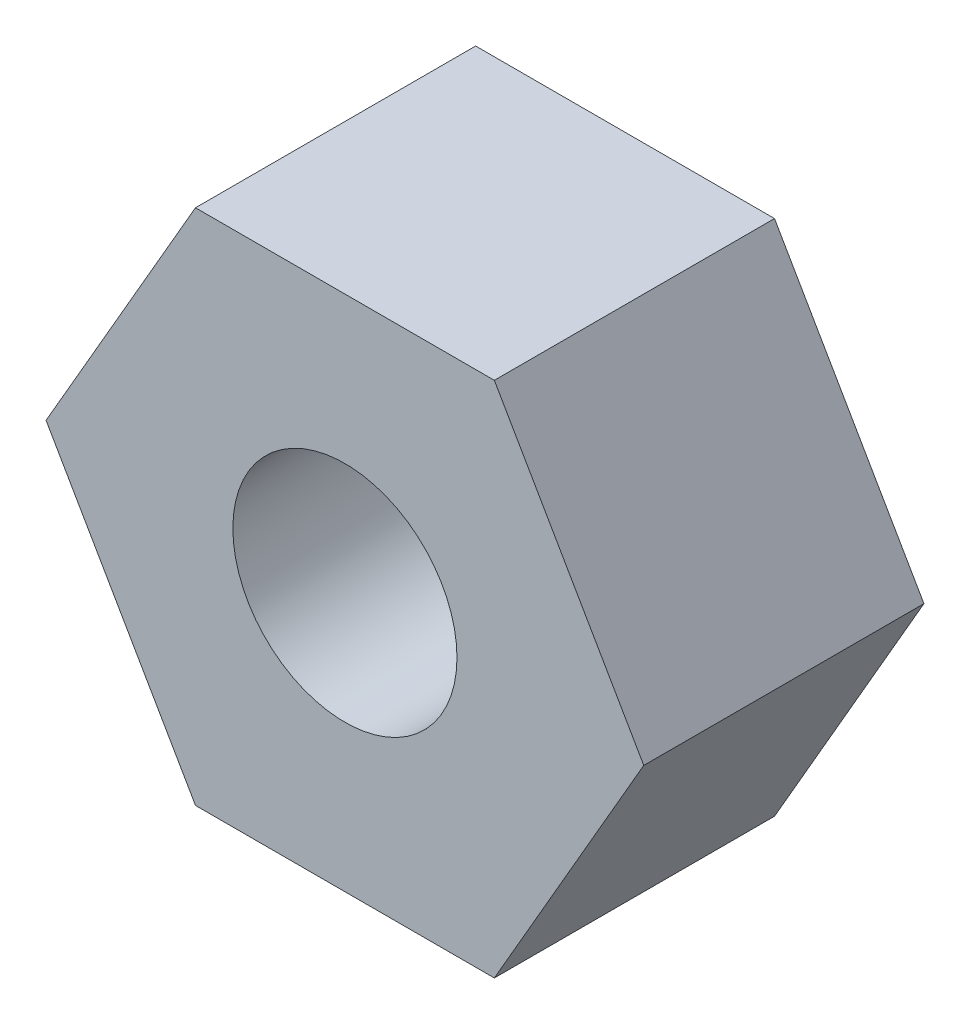
ISO-10303-21;
HEADER;
FILE_DESCRIPTION(('STEP AP214'),'2;1');
FILE_NAME('part.step','',(''),(''),'','','');
FILE_SCHEMA(('AUTOMOTIVE_DESIGN { 1 0 10303 214 1 1 1 1 }'));
ENDSEC;
DATA;
#1=APPLICATION_CONTEXT('core data for automotive mechanical design processes');
#2=APPLICATION_PROTOCOL_DEFINITION('international standard','automotive_design',2000,#1);
#3=PRODUCT_CONTEXT('',#1,'mechanical');
#4=PRODUCT('Part','Part','',(#3));
#5=PRODUCT_RELATED_PRODUCT_CATEGORY('part','',(#4));
#6=PRODUCT_DEFINITION_FORMATION('','',#4);
#7=PRODUCT_DEFINITION_CONTEXT('part definition',#1,'design');
#8=PRODUCT_DEFINITION('design','',#6,#7);
#9=PRODUCT_DEFINITION_SHAPE('','',#8);
#10=(LENGTH_UNIT() NAMED_UNIT(*) SI_UNIT(.MILLI.,.METRE.));
#11=(NAMED_UNIT(*) PLANE_ANGLE_UNIT() SI_UNIT($,.RADIAN.));
#12=(NAMED_UNIT(*) SI_UNIT($,.STERADIAN.) SOLID_ANGLE_UNIT());
#13=UNCERTAINTY_MEASURE_WITH_UNIT(LENGTH_MEASURE(1.E-05),#10,'distance_accuracy_value','');
#14=(GEOMETRIC_REPRESENTATION_CONTEXT(3) GLOBAL_UNCERTAINTY_ASSIGNED_CONTEXT((#13)) GLOBAL_UNIT_ASSIGNED_CONTEXT((#10,
#11,#12)) REPRESENTATION_CONTEXT('',''));
#15=CARTESIAN_POINT('',(0.,0.,0.));
#16=DIRECTION('',(0.,0.,1.));
#17=DIRECTION('',(1.,0.,0.));
#18=AXIS2_PLACEMENT_3D('',#15,#16,#17);
#19=CARTESIAN_POINT('',(3.2,0.,3.));
#20=DIRECTION('',(-0.866025403784439,-0.5,0.));
#21=DIRECTION('',(0.5,-0.866025403784439,0.));
#22=AXIS2_PLACEMENT_3D('',#19,#20,#21);
#23=PLANE('',#22);
#24=DIRECTION('',(-0.5,0.866025403784439,0.));
#25=VECTOR('',#24,1.);
#26=CARTESIAN_POINT('',(3.2,0.,0.));
#27=LINE('',#26,#25);
#28=CARTESIAN_POINT('',(3.2,0.,0.));
#29=VERTEX_POINT('',#28);
#30=CARTESIAN_POINT('',(1.6,2.7712812921102,0.));
#31=VERTEX_POINT('',#30);
#32=EDGE_CURVE('E128',#29,#31,#27,.T.);
#33=ORIENTED_EDGE('',*,*,#32,.T.);
#34=DIRECTION('',(0.,0.,-1.));
#35=VECTOR('',#34,1.);
#36=CARTESIAN_POINT('',(1.6,2.7712812921102,3.));
#37=LINE('',#36,#35);
#38=CARTESIAN_POINT('',(1.6,2.7712812921102,3.));
#39=VERTEX_POINT('',#38);
#40=EDGE_CURVE('E11',#39,#31,#37,.T.);
#41=ORIENTED_EDGE('',*,*,#40,.F.);
#42=DIRECTION('',(-0.5,0.866025403784439,0.));
#43=VECTOR('',#42,1.);
#44=CARTESIAN_POINT('',(3.2,0.,3.));
#45=LINE('',#44,#43);
#46=CARTESIAN_POINT('',(3.2,0.,3.));
#47=VERTEX_POINT('',#46);
#48=EDGE_CURVE('E145',#47,#39,#45,.T.);
#49=ORIENTED_EDGE('',*,*,#48,.F.);
#50=DIRECTION('',(0.,0.,-1.));
#51=VECTOR('',#50,1.);
#52=CARTESIAN_POINT('',(3.2,0.,3.));
#53=LINE('',#52,#51);
#54=EDGE_CURVE('E124',#47,#29,#53,.T.);
#55=ORIENTED_EDGE('',*,*,#54,.T.);
#56=EDGE_LOOP('',(#33,#41,#49,#55));
#57=FACE_BOUND('',#56,.T.);
#58=ADVANCED_FACE('F39',(#57),#23,.F.);
#59=CARTESIAN_POINT('',(1.6,2.7712812921102,3.));
#60=DIRECTION('',(0.,-1.,0.));
#61=DIRECTION('',(0.,0.,-1.));
#62=AXIS2_PLACEMENT_3D('',#59,#60,#61);
#63=PLANE('',#62);
#64=DIRECTION('',(-1.,0.,0.));
#65=VECTOR('',#64,1.);
#66=CARTESIAN_POINT('',(1.6,2.7712812921102,0.));
#67=LINE('',#66,#65);
#68=CARTESIAN_POINT('',(-1.6,2.7712812921102,0.));
#69=VERTEX_POINT('',#68);
#70=EDGE_CURVE('E132',#31,#69,#67,.T.);
#71=ORIENTED_EDGE('',*,*,#70,.T.);
#72=DIRECTION('',(0.,0.,-1.));
#73=VECTOR('',#72,1.);
#74=CARTESIAN_POINT('',(-1.6,2.7712812921102,3.));
#75=LINE('',#74,#73);
#76=CARTESIAN_POINT('',(-1.6,2.7712812921102,3.));
#77=VERTEX_POINT('',#76);
#78=EDGE_CURVE('E48',#77,#69,#75,.T.);
#79=ORIENTED_EDGE('',*,*,#78,.F.);
#80=DIRECTION('',(-1.,0.,0.));
#81=VECTOR('',#80,1.);
#82=CARTESIAN_POINT('',(1.6,2.7712812921102,3.));
#83=LINE('',#82,#81);
#84=EDGE_CURVE('E93',#39,#77,#83,.T.);
#85=ORIENTED_EDGE('',*,*,#84,.F.);
#86=ORIENTED_EDGE('',*,*,#40,.T.);
#87=EDGE_LOOP('',(#71,#79,#85,#86));
#88=FACE_BOUND('',#87,.T.);
#89=ADVANCED_FACE('F174',(#88),#63,.F.);
#90=CARTESIAN_POINT('',(-1.6,2.7712812921102,3.));
#91=DIRECTION('',(0.866025403784439,-0.5,0.));
#92=DIRECTION('',(0.5,0.866025403784439,0.));
#93=AXIS2_PLACEMENT_3D('',#90,#91,#92);
#94=PLANE('',#93);
#95=DIRECTION('',(-0.5,-0.866025403784438,0.));
#96=VECTOR('',#95,1.);
#97=CARTESIAN_POINT('',(-1.6,2.7712812921102,0.));
#98=LINE('',#97,#96);
#99=CARTESIAN_POINT('',(-3.2,0.,0.));
#100=VERTEX_POINT('',#99);
#101=EDGE_CURVE('E136',#69,#100,#98,.T.);
#102=ORIENTED_EDGE('',*,*,#101,.T.);
#103=DIRECTION('',(0.,0.,-1.));
#104=VECTOR('',#103,1.);
#105=CARTESIAN_POINT('',(-3.2,0.,3.));
#106=LINE('',#105,#104);
#107=CARTESIAN_POINT('',(-3.2,0.,3.));
#108=VERTEX_POINT('',#107);
#109=EDGE_CURVE('E117',#108,#100,#106,.T.);
#110=ORIENTED_EDGE('',*,*,#109,.F.);
#111=DIRECTION('',(-0.5,-0.866025403784438,0.));
#112=VECTOR('',#111,1.);
#113=CARTESIAN_POINT('',(-1.6,2.7712812921102,3.));
#114=LINE('',#113,#112);
#115=EDGE_CURVE('E106',#77,#108,#114,.T.);
#116=ORIENTED_EDGE('',*,*,#115,.F.);
#117=ORIENTED_EDGE('',*,*,#78,.T.);
#118=EDGE_LOOP('',(#102,#110,#116,#117));
#119=FACE_BOUND('',#118,.T.);
#120=ADVANCED_FACE('F155',(#119),#94,.F.);
#121=CARTESIAN_POINT('',(-3.2,0.,3.));
#122=DIRECTION('',(0.866025403784439,0.5,0.));
#123=DIRECTION('',(-0.5,0.866025403784439,0.));
#124=AXIS2_PLACEMENT_3D('',#121,#122,#123);
#125=PLANE('',#124);
#126=DIRECTION('',(0.5,-0.866025403784439,0.));
#127=VECTOR('',#126,1.);
#128=CARTESIAN_POINT('',(-3.2,0.,0.));
#129=LINE('',#128,#127);
#130=CARTESIAN_POINT('',(-1.6,-2.7712812921102,0.));
#131=VERTEX_POINT('',#130);
#132=EDGE_CURVE('E115',#100,#131,#129,.T.);
#133=ORIENTED_EDGE('',*,*,#132,.T.);
#134=DIRECTION('',(0.,0.,-1.));
#135=VECTOR('',#134,1.);
#136=CARTESIAN_POINT('',(-1.6,-2.7712812921102,3.));
#137=LINE('',#136,#135);
#138=CARTESIAN_POINT('',(-1.6,-2.7712812921102,3.));
#139=VERTEX_POINT('',#138);
#140=EDGE_CURVE('E112',#139,#131,#137,.T.);
#141=ORIENTED_EDGE('',*,*,#140,.F.);
#142=DIRECTION('',(0.5,-0.866025403784439,0.));
#143=VECTOR('',#142,1.);
#144=CARTESIAN_POINT('',(-3.2,0.,3.));
#145=LINE('',#144,#143);
#146=EDGE_CURVE('E100',#108,#139,#145,.T.);
#147=ORIENTED_EDGE('',*,*,#146,.F.);
#148=ORIENTED_EDGE('',*,*,#109,.T.);
#149=EDGE_LOOP('',(#133,#141,#147,#148));
#150=FACE_BOUND('',#149,.T.);
#151=ADVANCED_FACE('F113',(#150),#125,.F.);
#152=CARTESIAN_POINT('',(-1.6,-2.7712812921102,3.));
#153=DIRECTION('',(0.,1.,0.));
#154=DIRECTION('',(0.,0.,1.));
#155=AXIS2_PLACEMENT_3D('',#152,#153,#154);
#156=PLANE('',#155);
#157=DIRECTION('',(1.,0.,0.));
#158=VECTOR('',#157,1.);
#159=CARTESIAN_POINT('',(-1.6,-2.7712812921102,0.));
#160=LINE('',#159,#158);
#161=CARTESIAN_POINT('',(1.6,-2.7712812921102,0.));
#162=VERTEX_POINT('',#161);
#163=EDGE_CURVE('E79',#131,#162,#160,.T.);
#164=ORIENTED_EDGE('',*,*,#163,.T.);
#165=DIRECTION('',(0.,0.,-1.));
#166=VECTOR('',#165,1.);
#167=CARTESIAN_POINT('',(1.6,-2.7712812921102,3.));
#168=LINE('',#167,#166);
#169=CARTESIAN_POINT('',(1.6,-2.7712812921102,3.));
#170=VERTEX_POINT('',#169);
#171=EDGE_CURVE('E118',#170,#162,#168,.T.);
#172=ORIENTED_EDGE('',*,*,#171,.F.);
#173=DIRECTION('',(1.,0.,0.));
#174=VECTOR('',#173,1.);
#175=CARTESIAN_POINT('',(-1.6,-2.7712812921102,3.));
#176=LINE('',#175,#174);
#177=EDGE_CURVE('E104',#139,#170,#176,.T.);
#178=ORIENTED_EDGE('',*,*,#177,.F.);
#179=ORIENTED_EDGE('',*,*,#140,.T.);
#180=EDGE_LOOP('',(#164,#172,#178,#179));
#181=FACE_BOUND('',#180,.T.);
#182=ADVANCED_FACE('F120',(#181),#156,.F.);
#183=CARTESIAN_POINT('',(1.6,-2.7712812921102,3.));
#184=DIRECTION('',(-0.866025403784439,0.5,0.));
#185=DIRECTION('',(-0.5,-0.866025403784439,0.));
#186=AXIS2_PLACEMENT_3D('',#183,#184,#185);
#187=PLANE('',#186);
#188=DIRECTION('',(0.5,0.866025403784438,0.));
#189=VECTOR('',#188,1.);
#190=CARTESIAN_POINT('',(1.6,-2.7712812921102,0.));
#191=LINE('',#190,#189);
#192=EDGE_CURVE('E85',#162,#29,#191,.T.);
#193=ORIENTED_EDGE('',*,*,#192,.T.);
#194=ORIENTED_EDGE('',*,*,#54,.F.);
#195=DIRECTION('',(0.5,0.866025403784438,0.));
#196=VECTOR('',#195,1.);
#197=CARTESIAN_POINT('',(1.6,-2.7712812921102,3.));
#198=LINE('',#197,#196);
#199=EDGE_CURVE('E56',#170,#47,#198,.T.);
#200=ORIENTED_EDGE('',*,*,#199,.F.);
#201=ORIENTED_EDGE('',*,*,#171,.T.);
#202=EDGE_LOOP('',(#193,#194,#200,#201));
#203=FACE_BOUND('',#202,.T.);
#204=ADVANCED_FACE('F162',(#203),#187,.F.);
#205=CARTESIAN_POINT('',(0.,0.,3.));
#206=DIRECTION('',(0.,0.,1.));
#207=DIRECTION('',(1.,0.,0.));
#208=AXIS2_PLACEMENT_3D('',#205,#206,#207);
#209=PLANE('',#208);
#210=CARTESIAN_POINT('',(0.,0.,3.));
#211=DIRECTION('',(0.,0.,-1.));
#212=DIRECTION('',(-1.,0.,0.));
#213=AXIS2_PLACEMENT_3D('',#210,#211,#212);
#214=CIRCLE('',#213,1.2);
#215=CARTESIAN_POINT('',(-1.2,0.,3.));
#216=VERTEX_POINT('',#215);
#217=EDGE_CURVE('E133',#216,#216,#214,.T.);
#218=ORIENTED_EDGE('',*,*,#217,.T.);
#219=EDGE_LOOP('',(#218));
#220=FACE_BOUND('',#219,.T.);
#221=ORIENTED_EDGE('',*,*,#48,.T.);
#222=ORIENTED_EDGE('',*,*,#84,.T.);
#223=ORIENTED_EDGE('',*,*,#115,.T.);
#224=ORIENTED_EDGE('',*,*,#146,.T.);
#225=ORIENTED_EDGE('',*,*,#177,.T.);
#226=ORIENTED_EDGE('',*,*,#199,.T.);
#227=EDGE_LOOP('',(#221,#222,#223,#224,#225,#226));
#228=FACE_BOUND('',#227,.T.);
#229=ADVANCED_FACE('F102',(#220,#228),#209,.T.);
#230=CARTESIAN_POINT('',(0.,0.,0.));
#231=DIRECTION('',(0.,0.,1.));
#232=DIRECTION('',(1.,0.,0.));
#233=AXIS2_PLACEMENT_3D('',#230,#231,#232);
#234=PLANE('',#233);
#235=CARTESIAN_POINT('',(0.,0.,0.));
#236=DIRECTION('',(0.,0.,-1.));
#237=DIRECTION('',(-1.,0.,0.));
#238=AXIS2_PLACEMENT_3D('',#235,#236,#237);
#239=CIRCLE('',#238,1.2);
#240=CARTESIAN_POINT('',(-1.2,0.,0.));
#241=VERTEX_POINT('',#240);
#242=EDGE_CURVE('E229',#241,#241,#239,.T.);
#243=ORIENTED_EDGE('',*,*,#242,.F.);
#244=EDGE_LOOP('',(#243));
#245=FACE_BOUND('',#244,.T.);
#246=ORIENTED_EDGE('',*,*,#32,.F.);
#247=ORIENTED_EDGE('',*,*,#192,.F.);
#248=ORIENTED_EDGE('',*,*,#163,.F.);
#249=ORIENTED_EDGE('',*,*,#132,.F.);
#250=ORIENTED_EDGE('',*,*,#101,.F.);
#251=ORIENTED_EDGE('',*,*,#70,.F.);
#252=EDGE_LOOP('',(#246,#247,#248,#249,#250,#251));
#253=FACE_BOUND('',#252,.T.);
#254=ADVANCED_FACE('F158',(#245,#253),#234,.F.);
#255=CARTESIAN_POINT('',(0.,0.,3.));
#256=DIRECTION('',(0.,0.,-1.));
#257=DIRECTION('',(-1.,0.,0.));
#258=AXIS2_PLACEMENT_3D('',#255,#256,#257);
#259=CYLINDRICAL_SURFACE('',#258,1.2);
#260=ORIENTED_EDGE('',*,*,#217,.F.);
#261=EDGE_LOOP('',(#260));
#262=FACE_BOUND('',#261,.T.);
#263=ORIENTED_EDGE('',*,*,#242,.T.);
#264=EDGE_LOOP('',(#263));
#265=FACE_BOUND('',#264,.T.);
#266=ADVANCED_FACE('F211',(#262,#265),#259,.F.);
#267=CLOSED_SHELL('',(#58,#89,#120,#151,#182,#204,#229,#254,#266));
#268=MANIFOLD_SOLID_BREP('B2',#267);
#269=ADVANCED_BREP_SHAPE_REPRESENTATION('',(#18,#268),#14);
#270=SHAPE_DEFINITION_REPRESENTATION(#9,#269);
ENDSEC;
END-ISO-10303-21;
